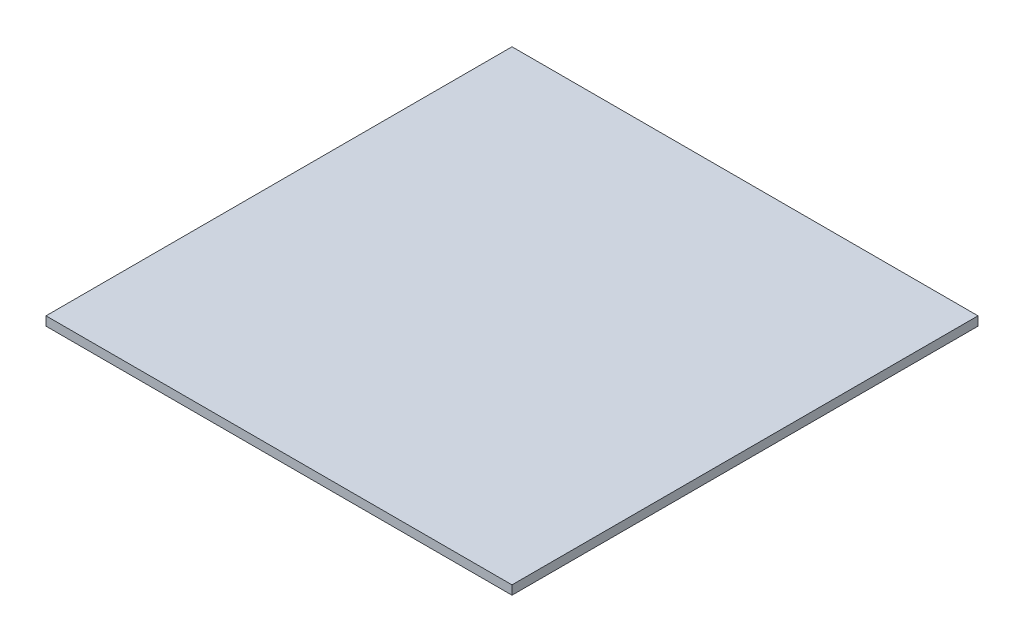
ISO-10303-21;
HEADER;
FILE_DESCRIPTION(('STEP AP214'),'2;1');
FILE_NAME('part.step','',(''),(''),'','','');
FILE_SCHEMA(('AUTOMOTIVE_DESIGN { 1 0 10303 214 1 1 1 1 }'));
ENDSEC;
DATA;
#1=APPLICATION_CONTEXT('core data for automotive mechanical design processes');
#2=APPLICATION_PROTOCOL_DEFINITION('international standard','automotive_design',2000,#1);
#3=PRODUCT_CONTEXT('',#1,'mechanical');
#4=PRODUCT('Part','Part','',(#3));
#5=PRODUCT_RELATED_PRODUCT_CATEGORY('part','',(#4));
#6=PRODUCT_DEFINITION_FORMATION('','',#4);
#7=PRODUCT_DEFINITION_CONTEXT('part definition',#1,'design');
#8=PRODUCT_DEFINITION('design','',#6,#7);
#9=PRODUCT_DEFINITION_SHAPE('','',#8);
#10=(LENGTH_UNIT() NAMED_UNIT(*) SI_UNIT(.MILLI.,.METRE.));
#11=(NAMED_UNIT(*) PLANE_ANGLE_UNIT() SI_UNIT($,.RADIAN.));
#12=(NAMED_UNIT(*) SI_UNIT($,.STERADIAN.) SOLID_ANGLE_UNIT());
#13=UNCERTAINTY_MEASURE_WITH_UNIT(LENGTH_MEASURE(1.E-05),#10,'distance_accuracy_value','');
#14=(GEOMETRIC_REPRESENTATION_CONTEXT(3) GLOBAL_UNCERTAINTY_ASSIGNED_CONTEXT((#13)) GLOBAL_UNIT_ASSIGNED_CONTEXT((#10,
#11,#12)) REPRESENTATION_CONTEXT('',''));
#15=CARTESIAN_POINT('',(0.,0.,0.));
#16=DIRECTION('',(0.,0.,1.));
#17=DIRECTION('',(1.,0.,0.));
#18=AXIS2_PLACEMENT_3D('',#15,#16,#17);
#19=CARTESIAN_POINT('',(0.,4.25,0.));
#20=DIRECTION('',(1.,0.,0.));
#21=DIRECTION('',(0.,0.,-1.));
#22=AXIS2_PLACEMENT_3D('',#19,#20,#21);
#23=PLANE('',#22);
#24=DIRECTION('',(0.,0.,1.));
#25=VECTOR('',#24,1.);
#26=CARTESIAN_POINT('',(0.,0.,0.));
#27=LINE('',#26,#25);
#28=CARTESIAN_POINT('',(0.,0.,-220.));
#29=VERTEX_POINT('',#28);
#30=CARTESIAN_POINT('',(0.,0.,0.));
#31=VERTEX_POINT('',#30);
#32=EDGE_CURVE('E107',#29,#31,#27,.T.);
#33=ORIENTED_EDGE('',*,*,#32,.T.);
#34=DIRECTION('',(0.,-1.,0.));
#35=VECTOR('',#34,1.);
#36=CARTESIAN_POINT('',(0.,4.25,0.));
#37=LINE('',#36,#35);
#38=CARTESIAN_POINT('',(0.,4.25,0.));
#39=VERTEX_POINT('',#38);
#40=EDGE_CURVE('E11',#39,#31,#37,.T.);
#41=ORIENTED_EDGE('',*,*,#40,.F.);
#42=DIRECTION('',(0.,0.,1.));
#43=VECTOR('',#42,1.);
#44=CARTESIAN_POINT('',(0.,4.25,0.));
#45=LINE('',#44,#43);
#46=CARTESIAN_POINT('',(0.,4.25,-220.));
#47=VERTEX_POINT('',#46);
#48=EDGE_CURVE('E91',#47,#39,#45,.T.);
#49=ORIENTED_EDGE('',*,*,#48,.F.);
#50=DIRECTION('',(0.,-1.,0.));
#51=VECTOR('',#50,1.);
#52=CARTESIAN_POINT('',(0.,4.25,-220.));
#53=LINE('',#52,#51);
#54=EDGE_CURVE('E103',#47,#29,#53,.T.);
#55=ORIENTED_EDGE('',*,*,#54,.T.);
#56=EDGE_LOOP('',(#33,#41,#49,#55));
#57=FACE_BOUND('',#56,.T.);
#58=ADVANCED_FACE('F39',(#57),#23,.F.);
#59=CARTESIAN_POINT('',(0.,4.25,0.));
#60=DIRECTION('',(0.,0.,-1.));
#61=DIRECTION('',(-1.,0.,0.));
#62=AXIS2_PLACEMENT_3D('',#59,#60,#61);
#63=PLANE('',#62);
#64=DIRECTION('',(1.,0.,0.));
#65=VECTOR('',#64,1.);
#66=CARTESIAN_POINT('',(0.,0.,0.));
#67=LINE('',#66,#65);
#68=CARTESIAN_POINT('',(220.,0.,0.));
#69=VERTEX_POINT('',#68);
#70=EDGE_CURVE('E96',#31,#69,#67,.T.);
#71=ORIENTED_EDGE('',*,*,#70,.T.);
#72=DIRECTION('',(0.,-1.,0.));
#73=VECTOR('',#72,1.);
#74=CARTESIAN_POINT('',(220.,4.25,0.));
#75=LINE('',#74,#73);
#76=CARTESIAN_POINT('',(220.,4.25,0.));
#77=VERTEX_POINT('',#76);
#78=EDGE_CURVE('E48',#77,#69,#75,.T.);
#79=ORIENTED_EDGE('',*,*,#78,.F.);
#80=DIRECTION('',(1.,0.,0.));
#81=VECTOR('',#80,1.);
#82=CARTESIAN_POINT('',(0.,4.25,0.));
#83=LINE('',#82,#81);
#84=EDGE_CURVE('E86',#39,#77,#83,.T.);
#85=ORIENTED_EDGE('',*,*,#84,.F.);
#86=ORIENTED_EDGE('',*,*,#40,.T.);
#87=EDGE_LOOP('',(#71,#79,#85,#86));
#88=FACE_BOUND('',#87,.T.);
#89=ADVANCED_FACE('F95',(#88),#63,.F.);
#90=CARTESIAN_POINT('',(220.,4.25,0.));
#91=DIRECTION('',(-1.,0.,0.));
#92=DIRECTION('',(0.,0.,1.));
#93=AXIS2_PLACEMENT_3D('',#90,#91,#92);
#94=PLANE('',#93);
#95=DIRECTION('',(0.,0.,-1.));
#96=VECTOR('',#95,1.);
#97=CARTESIAN_POINT('',(220.,0.,0.));
#98=LINE('',#97,#96);
#99=CARTESIAN_POINT('',(220.,0.,-220.));
#100=VERTEX_POINT('',#99);
#101=EDGE_CURVE('E73',#69,#100,#98,.T.);
#102=ORIENTED_EDGE('',*,*,#101,.T.);
#103=DIRECTION('',(0.,-1.,0.));
#104=VECTOR('',#103,1.);
#105=CARTESIAN_POINT('',(220.,4.25,-220.));
#106=LINE('',#105,#104);
#107=CARTESIAN_POINT('',(220.,4.25,-220.));
#108=VERTEX_POINT('',#107);
#109=EDGE_CURVE('E98',#108,#100,#106,.T.);
#110=ORIENTED_EDGE('',*,*,#109,.F.);
#111=DIRECTION('',(0.,0.,-1.));
#112=VECTOR('',#111,1.);
#113=CARTESIAN_POINT('',(220.,4.25,0.));
#114=LINE('',#113,#112);
#115=EDGE_CURVE('E89',#77,#108,#114,.T.);
#116=ORIENTED_EDGE('',*,*,#115,.F.);
#117=ORIENTED_EDGE('',*,*,#78,.T.);
#118=EDGE_LOOP('',(#102,#110,#116,#117));
#119=FACE_BOUND('',#118,.T.);
#120=ADVANCED_FACE('F99',(#119),#94,.F.);
#121=CARTESIAN_POINT('',(0.,4.25,-220.));
#122=DIRECTION('',(0.,0.,1.));
#123=DIRECTION('',(1.,0.,0.));
#124=AXIS2_PLACEMENT_3D('',#121,#122,#123);
#125=PLANE('',#124);
#126=DIRECTION('',(-1.,0.,0.));
#127=VECTOR('',#126,1.);
#128=CARTESIAN_POINT('',(0.,0.,-220.));
#129=LINE('',#128,#127);
#130=EDGE_CURVE('E79',#100,#29,#129,.T.);
#131=ORIENTED_EDGE('',*,*,#130,.T.);
#132=ORIENTED_EDGE('',*,*,#54,.F.);
#133=DIRECTION('',(-1.,0.,0.));
#134=VECTOR('',#133,1.);
#135=CARTESIAN_POINT('',(0.,4.25,-220.));
#136=LINE('',#135,#134);
#137=EDGE_CURVE('E56',#108,#47,#136,.T.);
#138=ORIENTED_EDGE('',*,*,#137,.F.);
#139=ORIENTED_EDGE('',*,*,#109,.T.);
#140=EDGE_LOOP('',(#131,#132,#138,#139));
#141=FACE_BOUND('',#140,.T.);
#142=ADVANCED_FACE('F120',(#141),#125,.F.);
#143=CARTESIAN_POINT('',(0.,4.25,0.));
#144=DIRECTION('',(0.,-1.,0.));
#145=DIRECTION('',(0.,0.,-1.));
#146=AXIS2_PLACEMENT_3D('',#143,#144,#145);
#147=PLANE('',#146);
#148=ORIENTED_EDGE('',*,*,#48,.T.);
#149=ORIENTED_EDGE('',*,*,#84,.T.);
#150=ORIENTED_EDGE('',*,*,#115,.T.);
#151=ORIENTED_EDGE('',*,*,#137,.T.);
#152=EDGE_LOOP('',(#148,#149,#150,#151));
#153=FACE_BOUND('',#152,.T.);
#154=ADVANCED_FACE('F87',(#153),#147,.F.);
#155=CARTESIAN_POINT('',(0.,0.,0.));
#156=DIRECTION('',(0.,-1.,0.));
#157=DIRECTION('',(0.,0.,-1.));
#158=AXIS2_PLACEMENT_3D('',#155,#156,#157);
#159=PLANE('',#158);
#160=ORIENTED_EDGE('',*,*,#32,.F.);
#161=ORIENTED_EDGE('',*,*,#130,.F.);
#162=ORIENTED_EDGE('',*,*,#101,.F.);
#163=ORIENTED_EDGE('',*,*,#70,.F.);
#164=EDGE_LOOP('',(#160,#161,#162,#163));
#165=FACE_BOUND('',#164,.T.);
#166=ADVANCED_FACE('F123',(#165),#159,.T.);
#167=CLOSED_SHELL('',(#58,#89,#120,#142,#154,#166));
#168=MANIFOLD_SOLID_BREP('B2',#167);
#169=ADVANCED_BREP_SHAPE_REPRESENTATION('',(#18,#168),#14);
#170=SHAPE_DEFINITION_REPRESENTATION(#9,#169);
ENDSEC;
END-ISO-10303-21;
